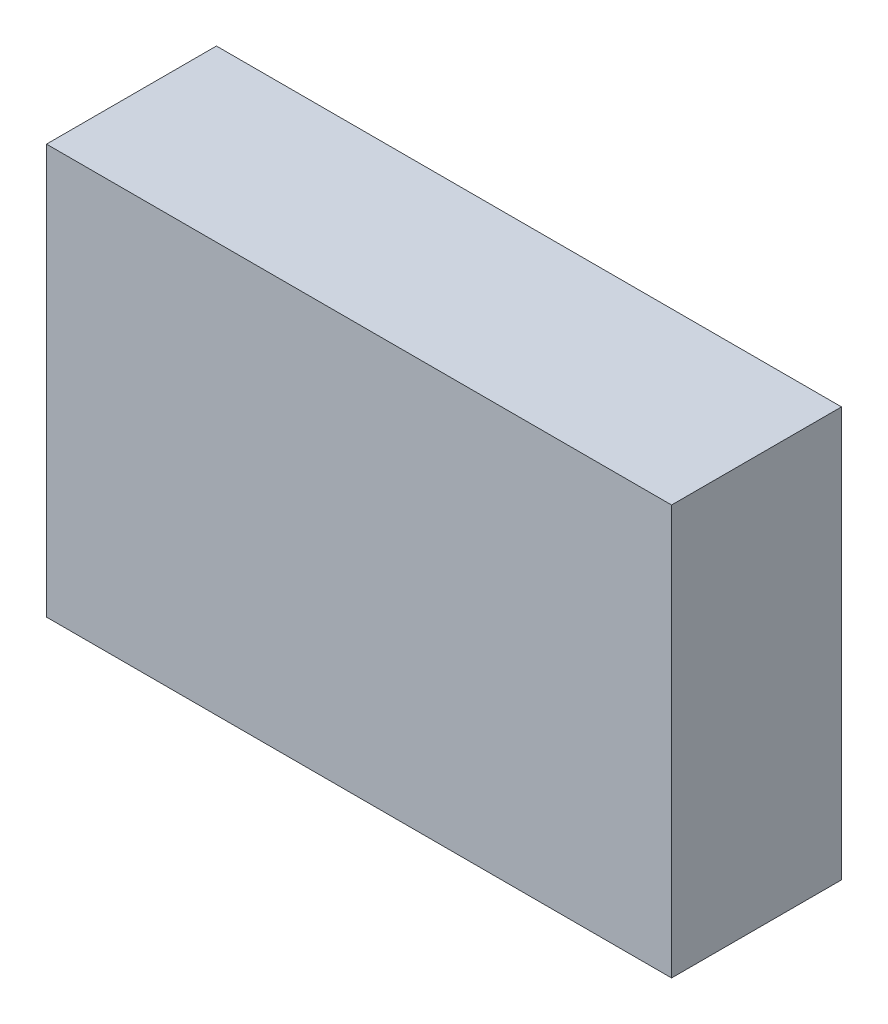
ISO-10303-21;
HEADER;
FILE_DESCRIPTION(('STEP AP214'),'2;1');
FILE_NAME('part.step','',(''),(''),'','','');
FILE_SCHEMA(('AUTOMOTIVE_DESIGN { 1 0 10303 214 1 1 1 1 }'));
ENDSEC;
DATA;
#1=APPLICATION_CONTEXT('core data for automotive mechanical design processes');
#2=APPLICATION_PROTOCOL_DEFINITION('international standard','automotive_design',2000,#1);
#3=PRODUCT_CONTEXT('',#1,'mechanical');
#4=PRODUCT('Part','Part','',(#3));
#5=PRODUCT_RELATED_PRODUCT_CATEGORY('part','',(#4));
#6=PRODUCT_DEFINITION_FORMATION('','',#4);
#7=PRODUCT_DEFINITION_CONTEXT('part definition',#1,'design');
#8=PRODUCT_DEFINITION('design','',#6,#7);
#9=PRODUCT_DEFINITION_SHAPE('','',#8);
#10=(LENGTH_UNIT() NAMED_UNIT(*) SI_UNIT(.MILLI.,.METRE.));
#11=(NAMED_UNIT(*) PLANE_ANGLE_UNIT() SI_UNIT($,.RADIAN.));
#12=(NAMED_UNIT(*) SI_UNIT($,.STERADIAN.) SOLID_ANGLE_UNIT());
#13=UNCERTAINTY_MEASURE_WITH_UNIT(LENGTH_MEASURE(1.E-05),#10,'distance_accuracy_value','');
#14=(GEOMETRIC_REPRESENTATION_CONTEXT(3) GLOBAL_UNCERTAINTY_ASSIGNED_CONTEXT((#13)) GLOBAL_UNIT_ASSIGNED_CONTEXT((#10,
#11,#12)) REPRESENTATION_CONTEXT('',''));
#15=CARTESIAN_POINT('',(0.,0.,0.));
#16=DIRECTION('',(0.,0.,1.));
#17=DIRECTION('',(1.,0.,0.));
#18=AXIS2_PLACEMENT_3D('',#15,#16,#17);
#19=CARTESIAN_POINT('',(0.07,0.,0.63));
#20=DIRECTION('',(0.,0.,1.));
#21=DIRECTION('',(1.,0.,0.));
#22=AXIS2_PLACEMENT_3D('',#19,#20,#21);
#23=PLANE('',#22);
#24=DIRECTION('',(0.,1.,0.));
#25=VECTOR('',#24,1.);
#26=CARTESIAN_POINT('',(0.07,0.,0.63));
#27=LINE('',#26,#25);
#28=CARTESIAN_POINT('',(0.07,0.,0.63));
#29=VERTEX_POINT('',#28);
#30=CARTESIAN_POINT('',(0.07,1.35,0.63));
#31=VERTEX_POINT('',#30);
#32=EDGE_CURVE('E69',#29,#31,#27,.T.);
#33=ORIENTED_EDGE('',*,*,#32,.F.);
#34=DIRECTION('',(1.,0.,0.));
#35=VECTOR('',#34,1.);
#36=CARTESIAN_POINT('',(0.07,0.,0.63));
#37=LINE('',#36,#35);
#38=CARTESIAN_POINT('',(2.13,0.,0.63));
#39=VERTEX_POINT('',#38);
#40=EDGE_CURVE('E64',#29,#39,#37,.T.);
#41=ORIENTED_EDGE('',*,*,#40,.T.);
#42=DIRECTION('',(0.,1.,0.));
#43=VECTOR('',#42,1.);
#44=CARTESIAN_POINT('',(2.13,0.,0.63));
#45=LINE('',#44,#43);
#46=CARTESIAN_POINT('',(2.13,1.35,0.63));
#47=VERTEX_POINT('',#46);
#48=EDGE_CURVE('E66',#39,#47,#45,.T.);
#49=ORIENTED_EDGE('',*,*,#48,.T.);
#50=DIRECTION('',(1.,0.,0.));
#51=VECTOR('',#50,1.);
#52=CARTESIAN_POINT('',(0.07,1.35,0.63));
#53=LINE('',#52,#51);
#54=EDGE_CURVE('E11',#31,#47,#53,.T.);
#55=ORIENTED_EDGE('',*,*,#54,.F.);
#56=EDGE_LOOP('',(#33,#41,#49,#55));
#57=FACE_BOUND('',#56,.T.);
#58=ADVANCED_FACE('F17',(#57),#23,.T.);
#59=CARTESIAN_POINT('',(0.07,0.,0.07));
#60=DIRECTION('',(0.,0.,1.));
#61=DIRECTION('',(1.,0.,0.));
#62=AXIS2_PLACEMENT_3D('',#59,#60,#61);
#63=PLANE('',#62);
#64=DIRECTION('',(1.,0.,0.));
#65=VECTOR('',#64,1.);
#66=CARTESIAN_POINT('',(0.07,1.35,0.07));
#67=LINE('',#66,#65);
#68=CARTESIAN_POINT('',(0.07,1.35,0.07));
#69=VERTEX_POINT('',#68);
#70=CARTESIAN_POINT('',(2.13,1.35,0.07));
#71=VERTEX_POINT('',#70);
#72=EDGE_CURVE('E26',#69,#71,#67,.T.);
#73=ORIENTED_EDGE('',*,*,#72,.T.);
#74=DIRECTION('',(0.,1.,0.));
#75=VECTOR('',#74,1.);
#76=CARTESIAN_POINT('',(2.13,0.,0.07));
#77=LINE('',#76,#75);
#78=CARTESIAN_POINT('',(2.13,0.,0.07));
#79=VERTEX_POINT('',#78);
#80=EDGE_CURVE('E87',#79,#71,#77,.T.);
#81=ORIENTED_EDGE('',*,*,#80,.F.);
#82=DIRECTION('',(1.,0.,0.));
#83=VECTOR('',#82,1.);
#84=CARTESIAN_POINT('',(0.07,0.,0.07));
#85=LINE('',#84,#83);
#86=CARTESIAN_POINT('',(0.07,0.,0.07));
#87=VERTEX_POINT('',#86);
#88=EDGE_CURVE('E75',#87,#79,#85,.T.);
#89=ORIENTED_EDGE('',*,*,#88,.F.);
#90=DIRECTION('',(0.,1.,0.));
#91=VECTOR('',#90,1.);
#92=CARTESIAN_POINT('',(0.07,0.,0.07));
#93=LINE('',#92,#91);
#94=EDGE_CURVE('E96',#87,#69,#93,.T.);
#95=ORIENTED_EDGE('',*,*,#94,.T.);
#96=EDGE_LOOP('',(#73,#81,#89,#95));
#97=FACE_BOUND('',#96,.T.);
#98=ADVANCED_FACE('F121',(#97),#63,.F.);
#99=CARTESIAN_POINT('',(0.07,1.35,0.07));
#100=DIRECTION('',(0.,1.,0.));
#101=DIRECTION('',(1.,0.,0.));
#102=AXIS2_PLACEMENT_3D('',#99,#100,#101);
#103=PLANE('',#102);
#104=ORIENTED_EDGE('',*,*,#72,.F.);
#105=DIRECTION('',(0.,0.,1.));
#106=VECTOR('',#105,1.);
#107=CARTESIAN_POINT('',(0.07,1.35,0.07));
#108=LINE('',#107,#106);
#109=EDGE_CURVE('E112',#69,#31,#108,.T.);
#110=ORIENTED_EDGE('',*,*,#109,.T.);
#111=ORIENTED_EDGE('',*,*,#54,.T.);
#112=DIRECTION('',(0.,0.,1.));
#113=VECTOR('',#112,1.);
#114=CARTESIAN_POINT('',(2.13,1.35,0.07));
#115=LINE('',#114,#113);
#116=EDGE_CURVE('E81',#71,#47,#115,.T.);
#117=ORIENTED_EDGE('',*,*,#116,.F.);
#118=EDGE_LOOP('',(#104,#110,#111,#117));
#119=FACE_BOUND('',#118,.T.);
#120=ADVANCED_FACE('F124',(#119),#103,.T.);
#121=CARTESIAN_POINT('',(0.07,0.,0.07));
#122=DIRECTION('',(0.,1.,0.));
#123=DIRECTION('',(1.,0.,0.));
#124=AXIS2_PLACEMENT_3D('',#121,#122,#123);
#125=PLANE('',#124);
#126=DIRECTION('',(0.,0.,1.));
#127=VECTOR('',#126,1.);
#128=CARTESIAN_POINT('',(2.13,0.,0.07));
#129=LINE('',#128,#127);
#130=EDGE_CURVE('E80',#79,#39,#129,.T.);
#131=ORIENTED_EDGE('',*,*,#130,.T.);
#132=ORIENTED_EDGE('',*,*,#40,.F.);
#133=DIRECTION('',(0.,0.,1.));
#134=VECTOR('',#133,1.);
#135=CARTESIAN_POINT('',(0.07,0.,0.07));
#136=LINE('',#135,#134);
#137=EDGE_CURVE('E88',#87,#29,#136,.T.);
#138=ORIENTED_EDGE('',*,*,#137,.F.);
#139=ORIENTED_EDGE('',*,*,#88,.T.);
#140=EDGE_LOOP('',(#131,#132,#138,#139));
#141=FACE_BOUND('',#140,.T.);
#142=ADVANCED_FACE('F84',(#141),#125,.F.);
#143=CARTESIAN_POINT('',(2.13,0.,0.07));
#144=DIRECTION('',(1.,0.,0.));
#145=DIRECTION('',(0.,1.,0.));
#146=AXIS2_PLACEMENT_3D('',#143,#144,#145);
#147=PLANE('',#146);
#148=ORIENTED_EDGE('',*,*,#130,.F.);
#149=ORIENTED_EDGE('',*,*,#80,.T.);
#150=ORIENTED_EDGE('',*,*,#116,.T.);
#151=ORIENTED_EDGE('',*,*,#48,.F.);
#152=EDGE_LOOP('',(#148,#149,#150,#151));
#153=FACE_BOUND('',#152,.T.);
#154=ADVANCED_FACE('F78',(#153),#147,.T.);
#155=CARTESIAN_POINT('',(0.07,0.,0.07));
#156=DIRECTION('',(1.,0.,0.));
#157=DIRECTION('',(0.,1.,0.));
#158=AXIS2_PLACEMENT_3D('',#155,#156,#157);
#159=PLANE('',#158);
#160=ORIENTED_EDGE('',*,*,#32,.T.);
#161=ORIENTED_EDGE('',*,*,#109,.F.);
#162=ORIENTED_EDGE('',*,*,#94,.F.);
#163=ORIENTED_EDGE('',*,*,#137,.T.);
#164=EDGE_LOOP('',(#160,#161,#162,#163));
#165=FACE_BOUND('',#164,.T.);
#166=ADVANCED_FACE('F123',(#165),#159,.F.);
#167=CLOSED_SHELL('',(#58,#98,#120,#142,#154,#166));
#168=MANIFOLD_SOLID_BREP('B1',#167);
#169=ADVANCED_BREP_SHAPE_REPRESENTATION('',(#18,#168),#14);
#170=SHAPE_DEFINITION_REPRESENTATION(#9,#169);
ENDSEC;
END-ISO-10303-21;
